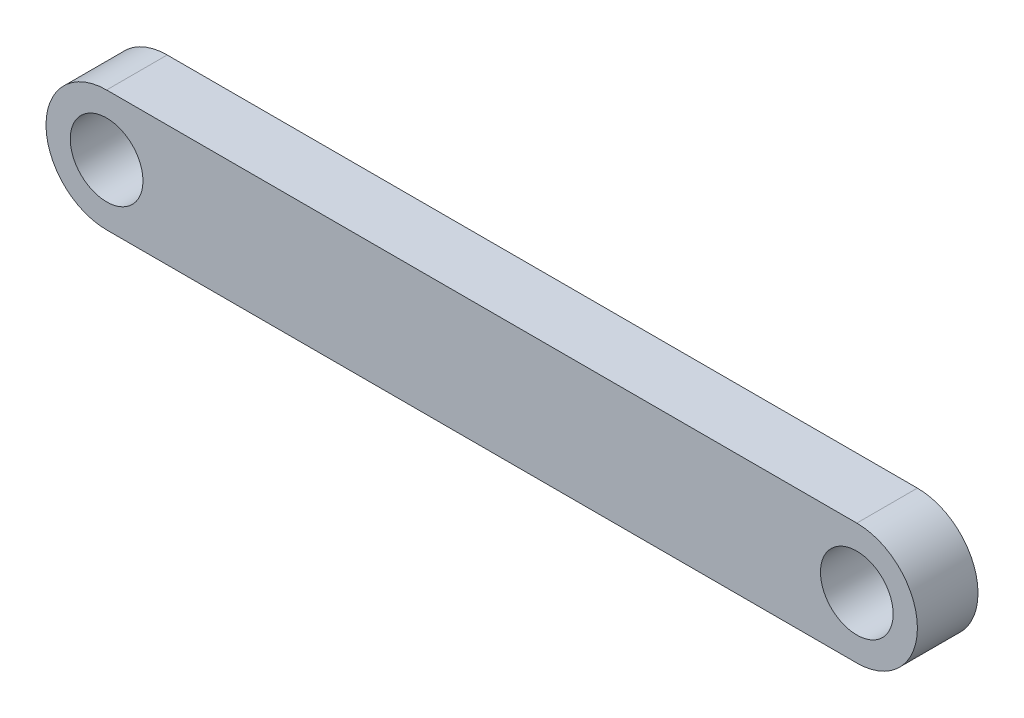
ISO-10303-21;
HEADER;
FILE_DESCRIPTION(('STEP AP214'),'2;1');
FILE_NAME('part.step','',(''),(''),'','','');
FILE_SCHEMA(('AUTOMOTIVE_DESIGN { 1 0 10303 214 1 1 1 1 }'));
ENDSEC;
DATA;
#1=APPLICATION_CONTEXT('core data for automotive mechanical design processes');
#2=APPLICATION_PROTOCOL_DEFINITION('international standard','automotive_design',2000,#1);
#3=PRODUCT_CONTEXT('',#1,'mechanical');
#4=PRODUCT('Part','Part','',(#3));
#5=PRODUCT_RELATED_PRODUCT_CATEGORY('part','',(#4));
#6=PRODUCT_DEFINITION_FORMATION('','',#4);
#7=PRODUCT_DEFINITION_CONTEXT('part definition',#1,'design');
#8=PRODUCT_DEFINITION('design','',#6,#7);
#9=PRODUCT_DEFINITION_SHAPE('','',#8);
#10=(LENGTH_UNIT() NAMED_UNIT(*) SI_UNIT(.MILLI.,.METRE.));
#11=(NAMED_UNIT(*) PLANE_ANGLE_UNIT() SI_UNIT($,.RADIAN.));
#12=(NAMED_UNIT(*) SI_UNIT($,.STERADIAN.) SOLID_ANGLE_UNIT());
#13=UNCERTAINTY_MEASURE_WITH_UNIT(LENGTH_MEASURE(1.E-05),#10,'distance_accuracy_value','');
#14=(GEOMETRIC_REPRESENTATION_CONTEXT(3) GLOBAL_UNCERTAINTY_ASSIGNED_CONTEXT((#13)) GLOBAL_UNIT_ASSIGNED_CONTEXT((#10,
#11,#12)) REPRESENTATION_CONTEXT('',''));
#15=CARTESIAN_POINT('',(0.,0.,0.));
#16=DIRECTION('',(0.,0.,1.));
#17=DIRECTION('',(1.,0.,0.));
#18=AXIS2_PLACEMENT_3D('',#15,#16,#17);
#19=CARTESIAN_POINT('',(30.95,0.,5.));
#20=DIRECTION('',(0.,0.,1.));
#21=DIRECTION('',(1.,0.,0.));
#22=AXIS2_PLACEMENT_3D('',#19,#20,#21);
#23=PLANE('',#22);
#24=CARTESIAN_POINT('',(-30.95,0.,5.));
#25=DIRECTION('',(0.,0.,1.));
#26=DIRECTION('',(1.,0.,0.));
#27=AXIS2_PLACEMENT_3D('',#24,#25,#26);
#28=CIRCLE('',#27,3.);
#29=CARTESIAN_POINT('',(-27.95,0.,5.));
#30=VERTEX_POINT('',#29);
#31=EDGE_CURVE('E99',#30,#30,#28,.T.);
#32=ORIENTED_EDGE('',*,*,#31,.F.);
#33=EDGE_LOOP('',(#32));
#34=FACE_BOUND('',#33,.T.);
#35=CARTESIAN_POINT('',(30.95,0.,5.));
#36=DIRECTION('',(0.,0.,1.));
#37=DIRECTION('',(1.,0.,0.));
#38=AXIS2_PLACEMENT_3D('',#35,#36,#37);
#39=CIRCLE('',#38,5.);
#40=CARTESIAN_POINT('',(30.95,-4.99999999999999,5.));
#41=VERTEX_POINT('',#40);
#42=CARTESIAN_POINT('',(30.95,5.00000000000001,5.));
#43=VERTEX_POINT('',#42);
#44=EDGE_CURVE('E84',#41,#43,#39,.T.);
#45=ORIENTED_EDGE('',*,*,#44,.T.);
#46=DIRECTION('',(-1.,0.,0.));
#47=VECTOR('',#46,1.);
#48=CARTESIAN_POINT('',(30.95,5.00000000000001,5.));
#49=LINE('',#48,#47);
#50=CARTESIAN_POINT('',(-30.95,5.,5.));
#51=VERTEX_POINT('',#50);
#52=EDGE_CURVE('E79',#43,#51,#49,.T.);
#53=ORIENTED_EDGE('',*,*,#52,.T.);
#54=CARTESIAN_POINT('',(-30.95,0.,5.));
#55=DIRECTION('',(0.,0.,1.));
#56=DIRECTION('',(1.,0.,0.));
#57=AXIS2_PLACEMENT_3D('',#54,#55,#56);
#58=CIRCLE('',#57,5.);
#59=CARTESIAN_POINT('',(-30.95,-5.00000000000001,5.));
#60=VERTEX_POINT('',#59);
#61=EDGE_CURVE('E82',#51,#60,#58,.T.);
#62=ORIENTED_EDGE('',*,*,#61,.T.);
#63=DIRECTION('',(1.,0.,0.));
#64=VECTOR('',#63,1.);
#65=CARTESIAN_POINT('',(30.95,-4.99999999999999,5.));
#66=LINE('',#65,#64);
#67=EDGE_CURVE('E49',#60,#41,#66,.T.);
#68=ORIENTED_EDGE('',*,*,#67,.T.);
#69=EDGE_LOOP('',(#45,#53,#62,#68));
#70=FACE_BOUND('',#69,.T.);
#71=CARTESIAN_POINT('',(30.95,0.,5.));
#72=DIRECTION('',(0.,0.,1.));
#73=DIRECTION('',(1.,0.,0.));
#74=AXIS2_PLACEMENT_3D('',#71,#72,#73);
#75=CIRCLE('',#74,3.);
#76=CARTESIAN_POINT('',(33.95,0.,5.));
#77=VERTEX_POINT('',#76);
#78=EDGE_CURVE('E114',#77,#77,#75,.T.);
#79=ORIENTED_EDGE('',*,*,#78,.F.);
#80=EDGE_LOOP('',(#79));
#81=FACE_BOUND('',#80,.T.);
#82=ADVANCED_FACE('F32',(#34,#70,#81),#23,.T.);
#83=CARTESIAN_POINT('',(30.95,0.,0.));
#84=DIRECTION('',(0.,0.,1.));
#85=DIRECTION('',(1.,0.,0.));
#86=AXIS2_PLACEMENT_3D('',#83,#84,#85);
#87=PLANE('',#86);
#88=CARTESIAN_POINT('',(30.95,0.,0.));
#89=DIRECTION('',(0.,0.,1.));
#90=DIRECTION('',(1.,0.,0.));
#91=AXIS2_PLACEMENT_3D('',#88,#89,#90);
#92=CIRCLE('',#91,5.);
#93=CARTESIAN_POINT('',(30.95,-4.99999999999999,0.));
#94=VERTEX_POINT('',#93);
#95=CARTESIAN_POINT('',(30.95,5.00000000000001,0.));
#96=VERTEX_POINT('',#95);
#97=EDGE_CURVE('E96',#94,#96,#92,.T.);
#98=ORIENTED_EDGE('',*,*,#97,.F.);
#99=DIRECTION('',(1.,0.,0.));
#100=VECTOR('',#99,1.);
#101=CARTESIAN_POINT('',(30.95,-4.99999999999999,0.));
#102=LINE('',#101,#100);
#103=CARTESIAN_POINT('',(-30.95,-5.00000000000001,0.));
#104=VERTEX_POINT('',#103);
#105=EDGE_CURVE('E72',#104,#94,#102,.T.);
#106=ORIENTED_EDGE('',*,*,#105,.F.);
#107=CARTESIAN_POINT('',(-30.95,0.,0.));
#108=DIRECTION('',(0.,0.,1.));
#109=DIRECTION('',(1.,0.,0.));
#110=AXIS2_PLACEMENT_3D('',#107,#108,#109);
#111=CIRCLE('',#110,5.);
#112=CARTESIAN_POINT('',(-30.95,5.,0.));
#113=VERTEX_POINT('',#112);
#114=EDGE_CURVE('E66',#113,#104,#111,.T.);
#115=ORIENTED_EDGE('',*,*,#114,.F.);
#116=DIRECTION('',(-1.,0.,0.));
#117=VECTOR('',#116,1.);
#118=CARTESIAN_POINT('',(30.95,5.00000000000001,0.));
#119=LINE('',#118,#117);
#120=EDGE_CURVE('E88',#96,#113,#119,.T.);
#121=ORIENTED_EDGE('',*,*,#120,.F.);
#122=EDGE_LOOP('',(#98,#106,#115,#121));
#123=FACE_BOUND('',#122,.T.);
#124=CARTESIAN_POINT('',(-30.95,0.,0.));
#125=DIRECTION('',(0.,0.,1.));
#126=DIRECTION('',(1.,0.,0.));
#127=AXIS2_PLACEMENT_3D('',#124,#125,#126);
#128=CIRCLE('',#127,3.);
#129=CARTESIAN_POINT('',(-27.95,0.,0.));
#130=VERTEX_POINT('',#129);
#131=EDGE_CURVE('E111',#130,#130,#128,.T.);
#132=ORIENTED_EDGE('',*,*,#131,.T.);
#133=EDGE_LOOP('',(#132));
#134=FACE_BOUND('',#133,.T.);
#135=CARTESIAN_POINT('',(30.95,0.,0.));
#136=DIRECTION('',(0.,0.,1.));
#137=DIRECTION('',(1.,0.,0.));
#138=AXIS2_PLACEMENT_3D('',#135,#136,#137);
#139=CIRCLE('',#138,3.);
#140=CARTESIAN_POINT('',(33.95,0.,0.));
#141=VERTEX_POINT('',#140);
#142=EDGE_CURVE('E117',#141,#141,#139,.T.);
#143=ORIENTED_EDGE('',*,*,#142,.T.);
#144=EDGE_LOOP('',(#143));
#145=FACE_BOUND('',#144,.T.);
#146=ADVANCED_FACE('F107',(#123,#134,#145),#87,.F.);
#147=CARTESIAN_POINT('',(30.95,0.,5.));
#148=DIRECTION('',(0.,0.,-1.));
#149=DIRECTION('',(-1.,0.,0.));
#150=AXIS2_PLACEMENT_3D('',#147,#148,#149);
#151=CYLINDRICAL_SURFACE('',#150,5.);
#152=ORIENTED_EDGE('',*,*,#97,.T.);
#153=DIRECTION('',(0.,0.,-1.));
#154=VECTOR('',#153,1.);
#155=CARTESIAN_POINT('',(30.95,5.00000000000001,5.));
#156=LINE('',#155,#154);
#157=EDGE_CURVE('E11',#43,#96,#156,.T.);
#158=ORIENTED_EDGE('',*,*,#157,.F.);
#159=ORIENTED_EDGE('',*,*,#44,.F.);
#160=DIRECTION('',(0.,0.,-1.));
#161=VECTOR('',#160,1.);
#162=CARTESIAN_POINT('',(30.95,-4.99999999999999,5.));
#163=LINE('',#162,#161);
#164=EDGE_CURVE('E92',#41,#94,#163,.T.);
#165=ORIENTED_EDGE('',*,*,#164,.T.);
#166=EDGE_LOOP('',(#152,#158,#159,#165));
#167=FACE_BOUND('',#166,.T.);
#168=ADVANCED_FACE('F34',(#167),#151,.T.);
#169=CARTESIAN_POINT('',(30.95,5.00000000000001,5.));
#170=DIRECTION('',(0.,-1.,0.));
#171=DIRECTION('',(1.,0.,0.));
#172=AXIS2_PLACEMENT_3D('',#169,#170,#171);
#173=PLANE('',#172);
#174=ORIENTED_EDGE('',*,*,#120,.T.);
#175=DIRECTION('',(0.,0.,-1.));
#176=VECTOR('',#175,1.);
#177=CARTESIAN_POINT('',(-30.95,5.,5.));
#178=LINE('',#177,#176);
#179=EDGE_CURVE('E41',#51,#113,#178,.T.);
#180=ORIENTED_EDGE('',*,*,#179,.F.);
#181=ORIENTED_EDGE('',*,*,#52,.F.);
#182=ORIENTED_EDGE('',*,*,#157,.T.);
#183=EDGE_LOOP('',(#174,#180,#181,#182));
#184=FACE_BOUND('',#183,.T.);
#185=ADVANCED_FACE('F87',(#184),#173,.F.);
#186=CARTESIAN_POINT('',(-30.95,0.,5.));
#187=DIRECTION('',(0.,0.,-1.));
#188=DIRECTION('',(-1.,0.,0.));
#189=AXIS2_PLACEMENT_3D('',#186,#187,#188);
#190=CYLINDRICAL_SURFACE('',#189,5.);
#191=ORIENTED_EDGE('',*,*,#114,.T.);
#192=DIRECTION('',(0.,0.,-1.));
#193=VECTOR('',#192,1.);
#194=CARTESIAN_POINT('',(-30.95,-5.00000000000001,5.));
#195=LINE('',#194,#193);
#196=EDGE_CURVE('E89',#60,#104,#195,.T.);
#197=ORIENTED_EDGE('',*,*,#196,.F.);
#198=ORIENTED_EDGE('',*,*,#61,.F.);
#199=ORIENTED_EDGE('',*,*,#179,.T.);
#200=EDGE_LOOP('',(#191,#197,#198,#199));
#201=FACE_BOUND('',#200,.T.);
#202=ADVANCED_FACE('F90',(#201),#190,.T.);
#203=CARTESIAN_POINT('',(30.95,-4.99999999999999,5.));
#204=DIRECTION('',(0.,1.,0.));
#205=DIRECTION('',(-1.,0.,0.));
#206=AXIS2_PLACEMENT_3D('',#203,#204,#205);
#207=PLANE('',#206);
#208=ORIENTED_EDGE('',*,*,#105,.T.);
#209=ORIENTED_EDGE('',*,*,#164,.F.);
#210=ORIENTED_EDGE('',*,*,#67,.F.);
#211=ORIENTED_EDGE('',*,*,#196,.T.);
#212=EDGE_LOOP('',(#208,#209,#210,#211));
#213=FACE_BOUND('',#212,.T.);
#214=ADVANCED_FACE('F104',(#213),#207,.F.);
#215=CARTESIAN_POINT('',(-30.95,0.,5.));
#216=DIRECTION('',(0.,0.,-1.));
#217=DIRECTION('',(-1.,0.,0.));
#218=AXIS2_PLACEMENT_3D('',#215,#216,#217);
#219=CYLINDRICAL_SURFACE('',#218,3.);
#220=ORIENTED_EDGE('',*,*,#31,.T.);
#221=EDGE_LOOP('',(#220));
#222=FACE_BOUND('',#221,.T.);
#223=ORIENTED_EDGE('',*,*,#131,.F.);
#224=EDGE_LOOP('',(#223));
#225=FACE_BOUND('',#224,.T.);
#226=ADVANCED_FACE('F134',(#222,#225),#219,.F.);
#227=CARTESIAN_POINT('',(30.95,0.,5.));
#228=DIRECTION('',(0.,0.,-1.));
#229=DIRECTION('',(-1.,0.,0.));
#230=AXIS2_PLACEMENT_3D('',#227,#228,#229);
#231=CYLINDRICAL_SURFACE('',#230,3.);
#232=ORIENTED_EDGE('',*,*,#78,.T.);
#233=EDGE_LOOP('',(#232));
#234=FACE_BOUND('',#233,.T.);
#235=ORIENTED_EDGE('',*,*,#142,.F.);
#236=EDGE_LOOP('',(#235));
#237=FACE_BOUND('',#236,.T.);
#238=ADVANCED_FACE('F123',(#234,#237),#231,.F.);
#239=CLOSED_SHELL('',(#82,#146,#168,#185,#202,#214,#226,#238));
#240=MANIFOLD_SOLID_BREP('B2',#239);
#241=ADVANCED_BREP_SHAPE_REPRESENTATION('',(#18,#240),#14);
#242=SHAPE_DEFINITION_REPRESENTATION(#9,#241);
ENDSEC;
END-ISO-10303-21;
